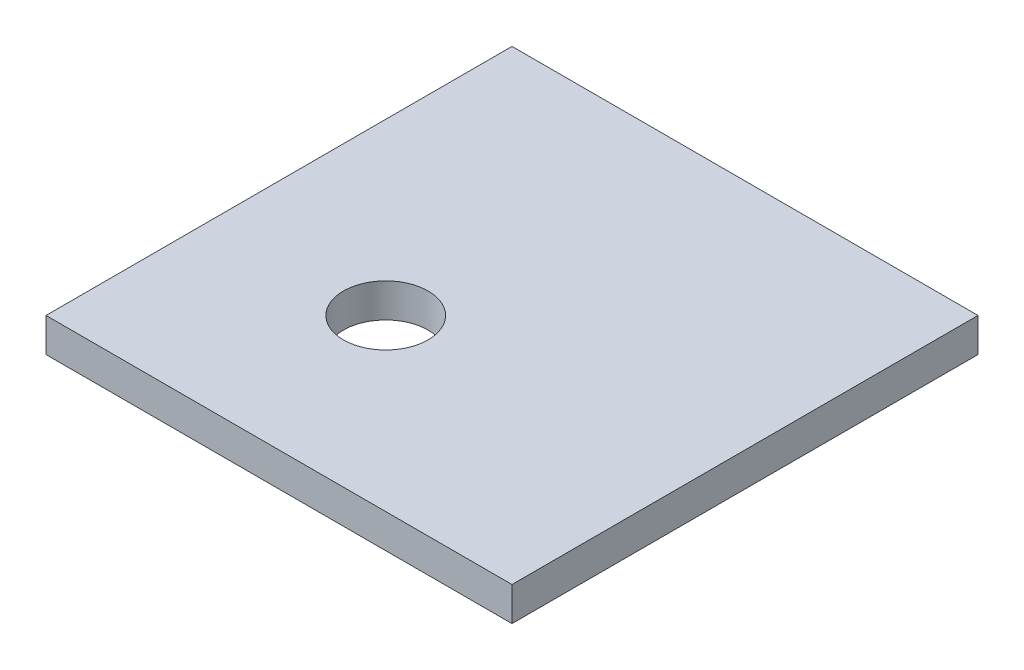
ISO-10303-21;
HEADER;
FILE_DESCRIPTION(('STEP AP214'),'2;1');
FILE_NAME('part.step','',(''),(''),'','','');
FILE_SCHEMA(('AUTOMOTIVE_DESIGN { 1 0 10303 214 1 1 1 1 }'));
ENDSEC;
DATA;
#1=APPLICATION_CONTEXT('core data for automotive mechanical design processes');
#2=APPLICATION_PROTOCOL_DEFINITION('international standard','automotive_design',2000,#1);
#3=PRODUCT_CONTEXT('',#1,'mechanical');
#4=PRODUCT('Part','Part','',(#3));
#5=PRODUCT_RELATED_PRODUCT_CATEGORY('part','',(#4));
#6=PRODUCT_DEFINITION_FORMATION('','',#4);
#7=PRODUCT_DEFINITION_CONTEXT('part definition',#1,'design');
#8=PRODUCT_DEFINITION('design','',#6,#7);
#9=PRODUCT_DEFINITION_SHAPE('','',#8);
#10=(LENGTH_UNIT() NAMED_UNIT(*) SI_UNIT(.MILLI.,.METRE.));
#11=(NAMED_UNIT(*) PLANE_ANGLE_UNIT() SI_UNIT($,.RADIAN.));
#12=(NAMED_UNIT(*) SI_UNIT($,.STERADIAN.) SOLID_ANGLE_UNIT());
#13=UNCERTAINTY_MEASURE_WITH_UNIT(LENGTH_MEASURE(1.E-05),#10,'distance_accuracy_value','');
#14=(GEOMETRIC_REPRESENTATION_CONTEXT(3) GLOBAL_UNCERTAINTY_ASSIGNED_CONTEXT((#13)) GLOBAL_UNIT_ASSIGNED_CONTEXT((#10,
#11,#12)) REPRESENTATION_CONTEXT('',''));
#15=CARTESIAN_POINT('',(0.,0.,0.));
#16=DIRECTION('',(0.,0.,1.));
#17=DIRECTION('',(1.,0.,0.));
#18=AXIS2_PLACEMENT_3D('',#15,#16,#17);
#19=CARTESIAN_POINT('',(-49.484240687679,8.,-35.1432664756447));
#20=DIRECTION('',(1.,0.,0.));
#21=DIRECTION('',(0.,0.,-1.));
#22=AXIS2_PLACEMENT_3D('',#19,#20,#21);
#23=PLANE('',#22);
#24=DIRECTION('',(0.,0.,1.));
#25=VECTOR('',#24,1.);
#26=CARTESIAN_POINT('',(-49.484240687679,0.,-35.1432664756447));
#27=LINE('',#26,#25);
#28=CARTESIAN_POINT('',(-49.484240687679,0.,-35.1432664756447));
#29=VERTEX_POINT('',#28);
#30=CARTESIAN_POINT('',(-49.484240687679,0.,74.8567335243553));
#31=VERTEX_POINT('',#30);
#32=EDGE_CURVE('E95',#29,#31,#27,.T.);
#33=ORIENTED_EDGE('',*,*,#32,.T.);
#34=DIRECTION('',(0.,-1.,0.));
#35=VECTOR('',#34,1.);
#36=CARTESIAN_POINT('',(-49.484240687679,8.,74.8567335243553));
#37=LINE('',#36,#35);
#38=CARTESIAN_POINT('',(-49.484240687679,8.,74.8567335243553));
#39=VERTEX_POINT('',#38);
#40=EDGE_CURVE('E11',#39,#31,#37,.T.);
#41=ORIENTED_EDGE('',*,*,#40,.F.);
#42=DIRECTION('',(0.,0.,1.));
#43=VECTOR('',#42,1.);
#44=CARTESIAN_POINT('',(-49.484240687679,8.,-35.1432664756447));
#45=LINE('',#44,#43);
#46=CARTESIAN_POINT('',(-49.484240687679,8.,-35.1432664756447));
#47=VERTEX_POINT('',#46);
#48=EDGE_CURVE('E81',#47,#39,#45,.T.);
#49=ORIENTED_EDGE('',*,*,#48,.F.);
#50=DIRECTION('',(0.,-1.,0.));
#51=VECTOR('',#50,1.);
#52=CARTESIAN_POINT('',(-49.484240687679,8.,-35.1432664756447));
#53=LINE('',#52,#51);
#54=EDGE_CURVE('E48',#47,#29,#53,.T.);
#55=ORIENTED_EDGE('',*,*,#54,.T.);
#56=EDGE_LOOP('',(#33,#41,#49,#55));
#57=FACE_BOUND('',#56,.T.);
#58=ADVANCED_FACE('F32',(#57),#23,.F.);
#59=CARTESIAN_POINT('',(-49.484240687679,8.,74.8567335243553));
#60=DIRECTION('',(0.,0.,-1.));
#61=DIRECTION('',(-1.,0.,0.));
#62=AXIS2_PLACEMENT_3D('',#59,#60,#61);
#63=PLANE('',#62);
#64=DIRECTION('',(1.,0.,0.));
#65=VECTOR('',#64,1.);
#66=CARTESIAN_POINT('',(-49.484240687679,0.,74.8567335243553));
#67=LINE('',#66,#65);
#68=CARTESIAN_POINT('',(60.515759312321,0.,74.8567335243553));
#69=VERTEX_POINT('',#68);
#70=EDGE_CURVE('E86',#31,#69,#67,.T.);
#71=ORIENTED_EDGE('',*,*,#70,.T.);
#72=DIRECTION('',(0.,-1.,0.));
#73=VECTOR('',#72,1.);
#74=CARTESIAN_POINT('',(60.515759312321,8.,74.8567335243553));
#75=LINE('',#74,#73);
#76=CARTESIAN_POINT('',(60.515759312321,8.,74.8567335243553));
#77=VERTEX_POINT('',#76);
#78=EDGE_CURVE('E40',#77,#69,#75,.T.);
#79=ORIENTED_EDGE('',*,*,#78,.F.);
#80=DIRECTION('',(1.,0.,0.));
#81=VECTOR('',#80,1.);
#82=CARTESIAN_POINT('',(-49.484240687679,8.,74.8567335243553));
#83=LINE('',#82,#81);
#84=EDGE_CURVE('E73',#39,#77,#83,.T.);
#85=ORIENTED_EDGE('',*,*,#84,.F.);
#86=ORIENTED_EDGE('',*,*,#40,.T.);
#87=EDGE_LOOP('',(#71,#79,#85,#86));
#88=FACE_BOUND('',#87,.T.);
#89=ADVANCED_FACE('F85',(#88),#63,.F.);
#90=CARTESIAN_POINT('',(60.515759312321,8.,-35.1432664756447));
#91=DIRECTION('',(1.,0.,0.));
#92=DIRECTION('',(0.,0.,-1.));
#93=AXIS2_PLACEMENT_3D('',#90,#91,#92);
#94=PLANE('',#93);
#95=DIRECTION('',(0.,0.,1.));
#96=VECTOR('',#95,1.);
#97=CARTESIAN_POINT('',(60.515759312321,0.,-35.1432664756447));
#98=LINE('',#97,#96);
#99=CARTESIAN_POINT('',(60.515759312321,0.,-35.1432664756447));
#100=VERTEX_POINT('',#99);
#101=EDGE_CURVE('E99',#100,#69,#98,.T.);
#102=ORIENTED_EDGE('',*,*,#101,.F.);
#103=DIRECTION('',(0.,-1.,0.));
#104=VECTOR('',#103,1.);
#105=CARTESIAN_POINT('',(60.515759312321,8.,-35.1432664756447));
#106=LINE('',#105,#104);
#107=CARTESIAN_POINT('',(60.515759312321,8.,-35.1432664756447));
#108=VERTEX_POINT('',#107);
#109=EDGE_CURVE('E62',#108,#100,#106,.T.);
#110=ORIENTED_EDGE('',*,*,#109,.F.);
#111=DIRECTION('',(0.,0.,1.));
#112=VECTOR('',#111,1.);
#113=CARTESIAN_POINT('',(60.515759312321,8.,-35.1432664756447));
#114=LINE('',#113,#112);
#115=EDGE_CURVE('E80',#108,#77,#114,.T.);
#116=ORIENTED_EDGE('',*,*,#115,.T.);
#117=ORIENTED_EDGE('',*,*,#78,.T.);
#118=EDGE_LOOP('',(#102,#110,#116,#117));
#119=FACE_BOUND('',#118,.T.);
#120=ADVANCED_FACE('F89',(#119),#94,.T.);
#121=CARTESIAN_POINT('',(-49.484240687679,8.,-35.1432664756447));
#122=DIRECTION('',(0.,0.,-1.));
#123=DIRECTION('',(-1.,0.,0.));
#124=AXIS2_PLACEMENT_3D('',#121,#122,#123);
#125=PLANE('',#124);
#126=DIRECTION('',(1.,0.,0.));
#127=VECTOR('',#126,1.);
#128=CARTESIAN_POINT('',(-49.484240687679,0.,-35.1432664756447));
#129=LINE('',#128,#127);
#130=EDGE_CURVE('E101',#29,#100,#129,.T.);
#131=ORIENTED_EDGE('',*,*,#130,.F.);
#132=ORIENTED_EDGE('',*,*,#54,.F.);
#133=DIRECTION('',(1.,0.,0.));
#134=VECTOR('',#133,1.);
#135=CARTESIAN_POINT('',(-49.484240687679,8.,-35.1432664756447));
#136=LINE('',#135,#134);
#137=EDGE_CURVE('E90',#47,#108,#136,.T.);
#138=ORIENTED_EDGE('',*,*,#137,.T.);
#139=ORIENTED_EDGE('',*,*,#109,.T.);
#140=EDGE_LOOP('',(#131,#132,#138,#139));
#141=FACE_BOUND('',#140,.T.);
#142=ADVANCED_FACE('F122',(#141),#125,.T.);
#143=CARTESIAN_POINT('',(0.,8.,0.));
#144=DIRECTION('',(0.,1.,0.));
#145=DIRECTION('',(0.,0.,1.));
#146=AXIS2_PLACEMENT_3D('',#143,#144,#145);
#147=PLANE('',#146);
#148=CARTESIAN_POINT('',(-9.38662259474388,8.,34.7591154314197));
#149=DIRECTION('',(0.,1.,0.));
#150=DIRECTION('',(0.,0.,1.));
#151=AXIS2_PLACEMENT_3D('',#148,#149,#150);
#152=CIRCLE('',#151,10.);
#153=CARTESIAN_POINT('',(-9.38662259474388,8.,44.7591154314198));
#154=VERTEX_POINT('',#153);
#155=EDGE_CURVE('E107',#154,#154,#152,.T.);
#156=ORIENTED_EDGE('',*,*,#155,.F.);
#157=EDGE_LOOP('',(#156));
#158=FACE_BOUND('',#157,.T.);
#159=ORIENTED_EDGE('',*,*,#48,.T.);
#160=ORIENTED_EDGE('',*,*,#84,.T.);
#161=ORIENTED_EDGE('',*,*,#115,.F.);
#162=ORIENTED_EDGE('',*,*,#137,.F.);
#163=EDGE_LOOP('',(#159,#160,#161,#162));
#164=FACE_BOUND('',#163,.T.);
#165=ADVANCED_FACE('F77',(#158,#164),#147,.T.);
#166=CARTESIAN_POINT('',(0.,0.,0.));
#167=DIRECTION('',(0.,1.,0.));
#168=DIRECTION('',(0.,0.,1.));
#169=AXIS2_PLACEMENT_3D('',#166,#167,#168);
#170=PLANE('',#169);
#171=CARTESIAN_POINT('',(-9.38662259474388,0.,34.7591154314197));
#172=DIRECTION('',(0.,1.,0.));
#173=DIRECTION('',(0.,0.,1.));
#174=AXIS2_PLACEMENT_3D('',#171,#172,#173);
#175=CIRCLE('',#174,10.);
#176=CARTESIAN_POINT('',(-9.38662259474388,0.,44.7591154314198));
#177=VERTEX_POINT('',#176);
#178=EDGE_CURVE('E97',#177,#177,#175,.T.);
#179=ORIENTED_EDGE('',*,*,#178,.T.);
#180=EDGE_LOOP('',(#179));
#181=FACE_BOUND('',#180,.T.);
#182=ORIENTED_EDGE('',*,*,#32,.F.);
#183=ORIENTED_EDGE('',*,*,#130,.T.);
#184=ORIENTED_EDGE('',*,*,#101,.T.);
#185=ORIENTED_EDGE('',*,*,#70,.F.);
#186=EDGE_LOOP('',(#182,#183,#184,#185));
#187=FACE_BOUND('',#186,.T.);
#188=ADVANCED_FACE('F113',(#181,#187),#170,.F.);
#189=CARTESIAN_POINT('',(-9.38662259474388,0.,34.7591154314197));
#190=DIRECTION('',(0.,1.,0.));
#191=DIRECTION('',(0.,0.,1.));
#192=AXIS2_PLACEMENT_3D('',#189,#190,#191);
#193=CYLINDRICAL_SURFACE('',#192,10.);
#194=ORIENTED_EDGE('',*,*,#178,.F.);
#195=EDGE_LOOP('',(#194));
#196=FACE_BOUND('',#195,.T.);
#197=ORIENTED_EDGE('',*,*,#155,.T.);
#198=EDGE_LOOP('',(#197));
#199=FACE_BOUND('',#198,.T.);
#200=ADVANCED_FACE('F115',(#196,#199),#193,.F.);
#201=CLOSED_SHELL('',(#58,#89,#120,#142,#165,#188,#200));
#202=MANIFOLD_SOLID_BREP('B2',#201);
#203=ADVANCED_BREP_SHAPE_REPRESENTATION('',(#18,#202),#14);
#204=SHAPE_DEFINITION_REPRESENTATION(#9,#203);
ENDSEC;
END-ISO-10303-21;
